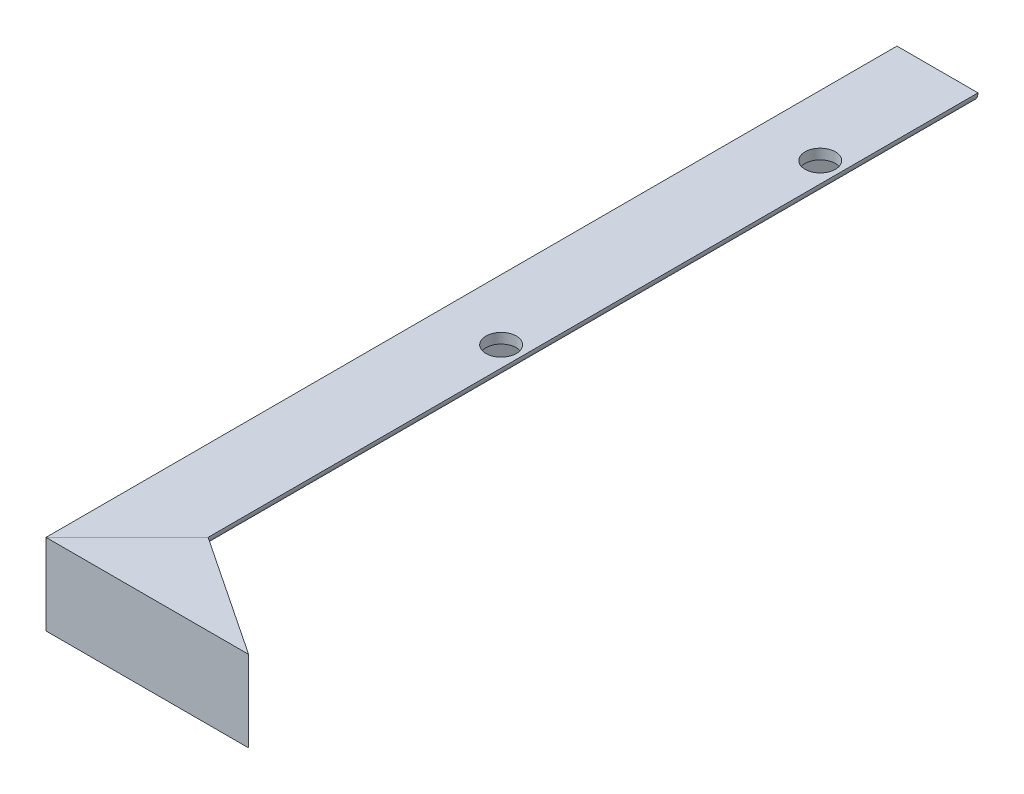
ISO-10303-21;
HEADER;
FILE_DESCRIPTION(('STEP AP214'),'2;1');
FILE_NAME('part.step','',(''),(''),'','','');
FILE_SCHEMA(('AUTOMOTIVE_DESIGN { 1 0 10303 214 1 1 1 1 }'));
ENDSEC;
DATA;
#1=APPLICATION_CONTEXT('core data for automotive mechanical design processes');
#2=APPLICATION_PROTOCOL_DEFINITION('international standard','automotive_design',2000,#1);
#3=PRODUCT_CONTEXT('',#1,'mechanical');
#4=PRODUCT('Part','Part','',(#3));
#5=PRODUCT_RELATED_PRODUCT_CATEGORY('part','',(#4));
#6=PRODUCT_DEFINITION_FORMATION('','',#4);
#7=PRODUCT_DEFINITION_CONTEXT('part definition',#1,'design');
#8=PRODUCT_DEFINITION('design','',#6,#7);
#9=PRODUCT_DEFINITION_SHAPE('','',#8);
#10=(LENGTH_UNIT() NAMED_UNIT(*) SI_UNIT(.MILLI.,.METRE.));
#11=(NAMED_UNIT(*) PLANE_ANGLE_UNIT() SI_UNIT($,.RADIAN.));
#12=(NAMED_UNIT(*) SI_UNIT($,.STERADIAN.) SOLID_ANGLE_UNIT());
#13=UNCERTAINTY_MEASURE_WITH_UNIT(LENGTH_MEASURE(1.E-05),#10,'distance_accuracy_value','');
#14=(GEOMETRIC_REPRESENTATION_CONTEXT(3) GLOBAL_UNCERTAINTY_ASSIGNED_CONTEXT((#13)) GLOBAL_UNIT_ASSIGNED_CONTEXT((#10,
#11,#12)) REPRESENTATION_CONTEXT('',''));
#15=CARTESIAN_POINT('',(0.,0.,0.));
#16=DIRECTION('',(0.,0.,1.));
#17=DIRECTION('',(1.,0.,0.));
#18=AXIS2_PLACEMENT_3D('',#15,#16,#17);
#19=CARTESIAN_POINT('',(5.27355936696949E-13,-50.8,0.));
#20=DIRECTION('',(1.,0.,0.));
#21=DIRECTION('',(0.,1.,0.));
#22=AXIS2_PLACEMENT_3D('',#19,#20,#21);
#23=PLANE('',#22);
#24=DIRECTION('',(0.,-1.,0.));
#25=VECTOR('',#24,1.);
#26=CARTESIAN_POINT('',(5.27355936696949E-13,-50.8,-5.27355936696949E-13));
#27=LINE('',#26,#25);
#28=CARTESIAN_POINT('',(0.,0.,0.));
#29=VERTEX_POINT('',#28);
#30=CARTESIAN_POINT('',(5.27355936696949E-13,-50.8,-5.27355936696949E-13));
#31=VERTEX_POINT('',#30);
#32=EDGE_CURVE('E252',#29,#31,#27,.T.);
#33=ORIENTED_EDGE('',*,*,#32,.F.);
#34=DIRECTION('',(0.,0.,-1.));
#35=VECTOR('',#34,1.);
#36=CARTESIAN_POINT('',(0.,0.,0.));
#37=LINE('',#36,#35);
#38=CARTESIAN_POINT('',(0.,0.,-533.4));
#39=VERTEX_POINT('',#38);
#40=EDGE_CURVE('E84',#29,#39,#37,.T.);
#41=ORIENTED_EDGE('',*,*,#40,.T.);
#42=DIRECTION('',(0.,-1.,0.));
#43=VECTOR('',#42,1.);
#44=CARTESIAN_POINT('',(5.27355936696949E-13,-50.8,-533.4));
#45=LINE('',#44,#43);
#46=CARTESIAN_POINT('',(5.27355936696949E-13,-50.8,-533.4));
#47=VERTEX_POINT('',#46);
#48=EDGE_CURVE('E227',#39,#47,#45,.T.);
#49=ORIENTED_EDGE('',*,*,#48,.T.);
#50=DIRECTION('',(0.,0.,-1.));
#51=VECTOR('',#50,1.);
#52=CARTESIAN_POINT('',(5.27355936696949E-13,-50.8,0.));
#53=LINE('',#52,#51);
#54=EDGE_CURVE('E226',#31,#47,#53,.T.);
#55=ORIENTED_EDGE('',*,*,#54,.F.);
#56=EDGE_LOOP('',(#33,#41,#49,#55));
#57=FACE_BOUND('',#56,.T.);
#58=ADVANCED_FACE('F80',(#57),#23,.F.);
#59=CARTESIAN_POINT('',(0.00508000000054576,-50.8,0.));
#60=DIRECTION('',(0.,1.,0.));
#61=DIRECTION('',(0.,0.,1.));
#62=AXIS2_PLACEMENT_3D('',#59,#60,#61);
#63=PLANE('',#62);
#64=DIRECTION('',(0.707106781186548,0.,-0.707106781186547));
#65=VECTOR('',#64,1.);
#66=CARTESIAN_POINT('',(0.00254000000027288,-50.8,-0.00254000000027288));
#67=LINE('',#66,#65);
#68=CARTESIAN_POINT('',(0.005080000000518,-50.8,-0.005080000000518));
#69=VERTEX_POINT('',#68);
#70=EDGE_CURVE('E248',#31,#69,#67,.T.);
#71=ORIENTED_EDGE('',*,*,#70,.F.);
#72=ORIENTED_EDGE('',*,*,#54,.T.);
#73=DIRECTION('',(1.,0.,0.));
#74=VECTOR('',#73,1.);
#75=CARTESIAN_POINT('',(0.00508000000054576,-50.8,-533.4));
#76=LINE('',#75,#74);
#77=CARTESIAN_POINT('',(0.005080000000518,-50.8,-533.4));
#78=VERTEX_POINT('',#77);
#79=EDGE_CURVE('E222',#47,#78,#76,.T.);
#80=ORIENTED_EDGE('',*,*,#79,.T.);
#81=DIRECTION('',(0.,0.,-1.));
#82=VECTOR('',#81,1.);
#83=CARTESIAN_POINT('',(0.005080000000518,-50.8,0.));
#84=LINE('',#83,#82);
#85=EDGE_CURVE('E221',#69,#78,#84,.T.);
#86=ORIENTED_EDGE('',*,*,#85,.F.);
#87=EDGE_LOOP('',(#71,#72,#80,#86));
#88=FACE_BOUND('',#87,.T.);
#89=ADVANCED_FACE('F309',(#88),#63,.F.);
#90=CARTESIAN_POINT('',(0.00508000000046249,-44.45508,0.));
#91=DIRECTION('',(0.,0.,-1.));
#92=DIRECTION('',(-1.,0.,0.));
#93=AXIS2_PLACEMENT_3D('',#90,#91,#92);
#94=CYLINDRICAL_SURFACE('',#93,6.34492);
#95=CARTESIAN_POINT('',(0.00508000000046249,-44.45508,-0.00508000000046249));
#96=DIRECTION('',(0.707106781186547,0.,0.707106781186548));
#97=DIRECTION('',(0.707106781186548,0.,-0.707106781186547));
#98=AXIS2_PLACEMENT_3D('',#95,#96,#97);
#99=ELLIPSE('',#98,8.97307191617229,6.34492);
#100=CARTESIAN_POINT('',(6.35000000000047,-44.4550799999999,-6.35000000000027));
#101=VERTEX_POINT('',#100);
#102=EDGE_CURVE('E244',#69,#101,#99,.T.);
#103=ORIENTED_EDGE('',*,*,#102,.F.);
#104=ORIENTED_EDGE('',*,*,#85,.T.);
#105=CARTESIAN_POINT('',(0.00508000000046249,-44.45508,-533.4));
#106=DIRECTION('',(0.,0.,1.));
#107=DIRECTION('',(1.,0.,0.));
#108=AXIS2_PLACEMENT_3D('',#105,#106,#107);
#109=CIRCLE('',#108,6.34492);
#110=CARTESIAN_POINT('',(6.35000000000047,-44.4550799999999,-533.4));
#111=VERTEX_POINT('',#110);
#112=EDGE_CURVE('E217',#78,#111,#109,.T.);
#113=ORIENTED_EDGE('',*,*,#112,.T.);
#114=DIRECTION('',(0.,0.,-1.));
#115=VECTOR('',#114,1.);
#116=CARTESIAN_POINT('',(6.35000000000047,-44.4550799999999,0.));
#117=LINE('',#116,#115);
#118=EDGE_CURVE('E216',#101,#111,#117,.T.);
#119=ORIENTED_EDGE('',*,*,#118,.F.);
#120=EDGE_LOOP('',(#103,#104,#113,#119));
#121=FACE_BOUND('',#120,.T.);
#122=ADVANCED_FACE('F289',(#121),#94,.T.);
#123=CARTESIAN_POINT('',(6.35000000000011,-11.1124999999999,0.));
#124=DIRECTION('',(-1.,0.,0.));
#125=DIRECTION('',(0.,-1.,0.));
#126=AXIS2_PLACEMENT_3D('',#123,#124,#125);
#127=PLANE('',#126);
#128=DIRECTION('',(0.,1.,0.));
#129=VECTOR('',#128,1.);
#130=CARTESIAN_POINT('',(6.35000000000011,-11.1124999999999,-6.35000000000011));
#131=LINE('',#130,#129);
#132=CARTESIAN_POINT('',(6.35000000000011,-11.1124999999999,-6.35000000000011));
#133=VERTEX_POINT('',#132);
#134=EDGE_CURVE('E240',#101,#133,#131,.T.);
#135=ORIENTED_EDGE('',*,*,#134,.F.);
#136=ORIENTED_EDGE('',*,*,#118,.T.);
#137=DIRECTION('',(0.,1.,0.));
#138=VECTOR('',#137,1.);
#139=CARTESIAN_POINT('',(6.35000000000011,-11.1124999999999,-533.4));
#140=LINE('',#139,#138);
#141=CARTESIAN_POINT('',(6.35000000000011,-11.1124999999999,-533.4));
#142=VERTEX_POINT('',#141);
#143=EDGE_CURVE('E212',#111,#142,#140,.T.);
#144=ORIENTED_EDGE('',*,*,#143,.T.);
#145=DIRECTION('',(0.,0.,-1.));
#146=VECTOR('',#145,1.);
#147=CARTESIAN_POINT('',(6.35000000000011,-11.1124999999999,0.));
#148=LINE('',#147,#146);
#149=EDGE_CURVE('E211',#133,#142,#148,.T.);
#150=ORIENTED_EDGE('',*,*,#149,.F.);
#151=EDGE_LOOP('',(#135,#136,#144,#150));
#152=FACE_BOUND('',#151,.T.);
#153=ADVANCED_FACE('F275',(#152),#127,.F.);
#154=CARTESIAN_POINT('',(11.1125000000001,-11.1124999999999,0.));
#155=DIRECTION('',(0.,0.,-1.));
#156=DIRECTION('',(-1.,0.,0.));
#157=AXIS2_PLACEMENT_3D('',#154,#155,#156);
#158=CYLINDRICAL_SURFACE('',#157,4.7625);
#159=CARTESIAN_POINT('',(11.1125000000001,-11.1124999999999,-11.1125000000001));
#160=DIRECTION('',(0.707106781186547,0.,0.707106781186548));
#161=DIRECTION('',(0.707106781186548,0.,-0.707106781186547));
#162=AXIS2_PLACEMENT_3D('',#159,#160,#161);
#163=ELLIPSE('',#162,6.73519209080186,4.7625);
#164=CARTESIAN_POINT('',(11.1125000000001,-6.34999999999991,-11.1125000000001));
#165=VERTEX_POINT('',#164);
#166=EDGE_CURVE('E236',#133,#165,#163,.F.);
#167=ORIENTED_EDGE('',*,*,#166,.F.);
#168=ORIENTED_EDGE('',*,*,#149,.T.);
#169=CARTESIAN_POINT('',(11.1125000000001,-11.1124999999999,-533.4));
#170=DIRECTION('',(0.,0.,-1.));
#171=DIRECTION('',(-1.,0.,0.));
#172=AXIS2_PLACEMENT_3D('',#169,#170,#171);
#173=CIRCLE('',#172,4.7625);
#174=CARTESIAN_POINT('',(11.1125000000001,-6.34999999999991,-533.4));
#175=VERTEX_POINT('',#174);
#176=EDGE_CURVE('E205',#142,#175,#173,.T.);
#177=ORIENTED_EDGE('',*,*,#176,.T.);
#178=DIRECTION('',(0.,0.,-1.));
#179=VECTOR('',#178,1.);
#180=CARTESIAN_POINT('',(11.1125000000001,-6.34999999999991,0.));
#181=LINE('',#180,#179);
#182=EDGE_CURVE('E200',#165,#175,#181,.T.);
#183=ORIENTED_EDGE('',*,*,#182,.F.);
#184=EDGE_LOOP('',(#167,#168,#177,#183));
#185=FACE_BOUND('',#184,.T.);
#186=ADVANCED_FACE('F270',(#185),#158,.F.);
#187=CARTESIAN_POINT('',(44.4550800000001,-6.34999999999952,0.));
#188=DIRECTION('',(0.,1.,0.));
#189=DIRECTION('',(-1.,0.,0.));
#190=AXIS2_PLACEMENT_3D('',#187,#188,#189);
#191=PLANE('',#190);
#192=DIRECTION('',(0.,0.,-1.));
#193=VECTOR('',#192,1.);
#194=CARTESIAN_POINT('',(44.4550800000001,-6.34999999999952,0.));
#195=LINE('',#194,#193);
#196=CARTESIAN_POINT('',(44.4550800000001,-6.34999999999952,-454.294968864879));
#197=VERTEX_POINT('',#196);
#198=CARTESIAN_POINT('',(44.4550800000001,-6.34999999999952,-533.4));
#199=VERTEX_POINT('',#198);
#200=EDGE_CURVE('E188',#197,#199,#195,.T.);
#201=ORIENTED_EDGE('',*,*,#200,.F.);
#202=CARTESIAN_POINT('',(38.1000000000001,-6.34999999999958,-447.2));
#203=DIRECTION('',(0.,1.,0.));
#204=DIRECTION('',(-1.,0.,0.));
#205=AXIS2_PLACEMENT_3D('',#202,#203,#204);
#206=CIRCLE('',#205,9.525);
#207=CARTESIAN_POINT('',(44.4550800000001,-6.34999999999952,-440.105031135121));
#208=VERTEX_POINT('',#207);
#209=EDGE_CURVE('E97',#197,#208,#206,.T.);
#210=ORIENTED_EDGE('',*,*,#209,.T.);
#211=CARTESIAN_POINT('',(44.4550800000001,-6.34999999999952,-254.294968864879));
#212=VERTEX_POINT('',#211);
#213=EDGE_CURVE('E178',#212,#208,#195,.T.);
#214=ORIENTED_EDGE('',*,*,#213,.F.);
#215=CARTESIAN_POINT('',(38.1000000000001,-6.34999999999958,-247.2));
#216=DIRECTION('',(0.,1.,0.));
#217=DIRECTION('',(-1.,0.,0.));
#218=AXIS2_PLACEMENT_3D('',#215,#216,#217);
#219=CIRCLE('',#218,9.525);
#220=CARTESIAN_POINT('',(44.4550800000001,-6.34999999999952,-240.105031135121));
#221=VERTEX_POINT('',#220);
#222=EDGE_CURVE('E104',#212,#221,#219,.T.);
#223=ORIENTED_EDGE('',*,*,#222,.T.);
#224=CARTESIAN_POINT('',(44.4550800000001,-6.34999999999952,-44.4550800000001));
#225=VERTEX_POINT('',#224);
#226=EDGE_CURVE('E176',#225,#221,#195,.T.);
#227=ORIENTED_EDGE('',*,*,#226,.F.);
#228=DIRECTION('',(0.707106781186548,0.,-0.707106781186547));
#229=VECTOR('',#228,1.);
#230=CARTESIAN_POINT('',(22.22754,-6.34999999999974,-22.22754));
#231=LINE('',#230,#229);
#232=EDGE_CURVE('E233',#165,#225,#231,.T.);
#233=ORIENTED_EDGE('',*,*,#232,.F.);
#234=ORIENTED_EDGE('',*,*,#182,.T.);
#235=DIRECTION('',(1.,0.,0.));
#236=VECTOR('',#235,1.);
#237=CARTESIAN_POINT('',(44.4550800000001,-6.34999999999952,-533.4));
#238=LINE('',#237,#236);
#239=EDGE_CURVE('E197',#175,#199,#238,.T.);
#240=ORIENTED_EDGE('',*,*,#239,.T.);
#241=EDGE_LOOP('',(#201,#210,#214,#223,#227,#233,#234,#240));
#242=FACE_BOUND('',#241,.T.);
#243=ADVANCED_FACE('F175',(#242),#191,.F.);
#244=CARTESIAN_POINT('',(44.45508,-0.00507999999954656,0.));
#245=DIRECTION('',(0.,0.,-1.));
#246=DIRECTION('',(-1.,0.,0.));
#247=AXIS2_PLACEMENT_3D('',#244,#245,#246);
#248=CYLINDRICAL_SURFACE('',#247,6.34492);
#249=ORIENTED_EDGE('',*,*,#213,.T.);
#250=CARTESIAN_POINT('',(44.4550800000001,-6.34999999999952,-440.105031135121));
#251=CARTESIAN_POINT('',(44.5563779594089,-6.34999862370733,-440.195761966752));
#252=CARTESIAN_POINT('',(44.6556993733316,-6.34757433182725,-440.288639685095));
#253=CARTESIAN_POINT('',(44.8501490510317,-6.33843650849954,-440.478426011735));
#254=CARTESIAN_POINT('',(44.9452786625206,-6.33172436656001,-440.575333304711));
#255=CARTESIAN_POINT('',(45.2237590366207,-6.30602088334706,-440.871415730806));
#256=CARTESIAN_POINT('',(45.4005923809026,-6.28145817985227,-441.076302076079));
#257=CARTESIAN_POINT('',(45.7350142586764,-6.22187702064616,-441.498717818989));
#258=CARTESIAN_POINT('',(45.8926547490551,-6.1868877190747,-441.716210619086));
#259=CARTESIAN_POINT('',(46.1886354442025,-6.11050030574277,-442.162994648589));
#260=CARTESIAN_POINT('',(46.3269682581813,-6.06909975254033,-442.39229035031));
#261=CARTESIAN_POINT('',(46.5703682408334,-5.98824494608204,-442.836983427356));
#262=CARTESIAN_POINT('',(46.6773974646644,-5.94903406434178,-443.051356314113));
#263=CARTESIAN_POINT('',(46.875034236627,-5.87134831627728,-443.487625045941));
#264=CARTESIAN_POINT('',(46.9656453454203,-5.83287329198757,-443.709519247413));
#265=CARTESIAN_POINT('',(47.1300520967265,-5.75926584218762,-444.160050976628));
#266=CARTESIAN_POINT('',(47.2038447966409,-5.72413400223613,-444.388689676516));
#267=CARTESIAN_POINT('',(47.3341043829323,-5.65968100352047,-444.851647554618));
#268=CARTESIAN_POINT('',(47.3905725495582,-5.63035941544686,-445.085966311704));
#269=CARTESIAN_POINT('',(47.4909870384248,-5.57687468936956,-445.58542182007));
#270=CARTESIAN_POINT('',(47.5328404923784,-5.55364876311484,-445.851086220786));
#271=CARTESIAN_POINT('',(47.593950866842,-5.51931078171624,-446.385798238018));
#272=CARTESIAN_POINT('',(47.613207806435,-5.50819871634216,-446.654845851676));
#273=CARTESIAN_POINT('',(47.6288062695833,-5.49921835890336,-447.193610874144));
#274=CARTESIAN_POINT('',(47.6251666495659,-5.50133916891232,-447.463327548989));
#275=CARTESIAN_POINT('',(47.5950754194385,-5.51858483893105,-448.001046274788));
#276=CARTESIAN_POINT('',(47.5686250284081,-5.53370900400039,-448.269048416601));
#277=CARTESIAN_POINT('',(47.4980550660229,-5.5728169990329,-448.767616842991));
#278=CARTESIAN_POINT('',(47.4565622628771,-5.59545453960822,-448.998669182044));
#279=CARTESIAN_POINT('',(47.3568691241608,-5.64784509973559,-449.456287291273));
#280=CARTESIAN_POINT('',(47.2986700837823,-5.6775975676556,-449.682853407799));
#281=CARTESIAN_POINT('',(47.1658886583961,-5.74223788015527,-450.130869360827));
#282=CARTESIAN_POINT('',(47.0912734472015,-5.77713596726113,-450.352307949427));
#283=CARTESIAN_POINT('',(46.9261636292398,-5.84972580615955,-450.788718384044));
#284=CARTESIAN_POINT('',(46.8356676208546,-5.88741780436926,-451.003689657302));
#285=CARTESIAN_POINT('',(46.6287403307717,-5.96719195704309,-451.448846077261));
#286=CARTESIAN_POINT('',(46.5105748164837,-6.00931493678623,-451.678219851227));
#287=CARTESIAN_POINT('',(46.2557338495108,-6.09059926644392,-452.127093390984));
#288=CARTESIAN_POINT('',(46.1190533459422,-6.12975980364605,-452.346590440564));
#289=CARTESIAN_POINT('',(45.8282337074499,-6.20143500335729,-452.773738436268));
#290=CARTESIAN_POINT('',(45.6741564466262,-6.23397213321665,-452.981427647297));
#291=CARTESIAN_POINT('',(45.348951106171,-6.28888109909382,-453.384272609183));
#292=CARTESIAN_POINT('',(45.1778378017148,-6.31126165174947,-453.579438983461));
#293=CARTESIAN_POINT('',(44.9118026271652,-6.33414285631068,-453.858896301083));
#294=CARTESIAN_POINT('',(44.822951028509,-6.33997663830193,-453.948592338069));
#295=CARTESIAN_POINT('',(44.6416614562835,-6.34790483255884,-454.124467145055));
#296=CARTESIAN_POINT('',(44.5492232026355,-6.34999895219452,-454.210645639291));
#297=CARTESIAN_POINT('',(44.4550800000001,-6.34999999999952,-454.294968864879));
#298=B_SPLINE_CURVE_WITH_KNOTS('',3,(#250,#251,#252,#253,#254,#255,#256,#257,#258,#259,#260,
#261,#262,#263,#264,#265,#266,#267,#268,#269,#270,#271,#272,#273,#274,#275,#276,#277,#278,#279,
#280,#281,#282,#283,#284,#285,#286,#287,#288,#289,#290,#291,#292,#293,#294,#295,#296,#297),
.UNSPECIFIED.,.F.,.F.,(4,2,2,2,2,2,2,2,2,2,2,2,2,2,2,2,2,2,2,2,2,2,2,4),(0.,0.407849550664783,
0.815567001799738,1.62943377951579,2.44104589737142,3.25296784532845,3.98069420808277,
4.70826255653464,5.43595810493962,6.16359986511574,6.97221878219325,7.78083701638815,
8.58878940148315,9.39669860973147,10.1034583867908,10.8101633853569,11.5182945847553,
12.2264883143365,13.0099513927473,13.7936286316985,14.5746015461289,15.3549029359011,
15.7339321533064,16.1129910285898),.UNSPECIFIED.);
#299=EDGE_CURVE('E180',#208,#197,#298,.T.);
#300=ORIENTED_EDGE('',*,*,#299,.T.);
#301=ORIENTED_EDGE('',*,*,#200,.T.);
#302=CARTESIAN_POINT('',(44.45508,-0.00507999999954656,-533.4));
#303=DIRECTION('',(0.,0.,1.));
#304=DIRECTION('',(-1.,0.,0.));
#305=AXIS2_PLACEMENT_3D('',#302,#303,#304);
#306=CIRCLE('',#305,6.34492);
#307=CARTESIAN_POINT('',(50.8,-0.00507999999949105,-533.4));
#308=VERTEX_POINT('',#307);
#309=EDGE_CURVE('E186',#199,#308,#306,.T.);
#310=ORIENTED_EDGE('',*,*,#309,.T.);
#311=DIRECTION('',(0.,0.,-1.));
#312=VECTOR('',#311,1.);
#313=CARTESIAN_POINT('',(50.8,-0.00507999999949105,0.));
#314=LINE('',#313,#312);
#315=CARTESIAN_POINT('',(50.8,-0.00507999999949105,-50.8));
#316=VERTEX_POINT('',#315);
#317=EDGE_CURVE('E192',#316,#308,#314,.T.);
#318=ORIENTED_EDGE('',*,*,#317,.F.);
#319=CARTESIAN_POINT('',(44.45508,-0.00507999999954656,-44.45508));
#320=DIRECTION('',(0.707106781186547,0.,0.707106781186548));
#321=DIRECTION('',(0.707106781186548,0.,-0.707106781186547));
#322=AXIS2_PLACEMENT_3D('',#319,#320,#321);
#323=ELLIPSE('',#322,8.97307191617229,6.34492);
#324=EDGE_CURVE('E90',#225,#316,#323,.T.);
#325=ORIENTED_EDGE('',*,*,#324,.F.);
#326=ORIENTED_EDGE('',*,*,#226,.T.);
#327=CARTESIAN_POINT('',(44.4550800000001,-6.34999999999952,-240.105031135121));
#328=CARTESIAN_POINT('',(44.5563779594089,-6.34999862370733,-240.195761966752));
#329=CARTESIAN_POINT('',(44.6556993733316,-6.34757433182725,-240.288639685095));
#330=CARTESIAN_POINT('',(44.8501490510317,-6.33843650849954,-240.478426011735));
#331=CARTESIAN_POINT('',(44.9452786625206,-6.33172436656001,-240.575333304711));
#332=CARTESIAN_POINT('',(45.2237590366208,-6.30602088334706,-240.871415730806));
#333=CARTESIAN_POINT('',(45.4005923809027,-6.28145817985227,-241.076302076079));
#334=CARTESIAN_POINT('',(45.7350142586764,-6.22187702064616,-241.498717818989));
#335=CARTESIAN_POINT('',(45.8926547490551,-6.18688771907469,-241.716210619086));
#336=CARTESIAN_POINT('',(46.1886354442025,-6.11050030574277,-242.162994648589));
#337=CARTESIAN_POINT('',(46.3269682581813,-6.06909975254033,-242.39229035031));
#338=CARTESIAN_POINT('',(46.5703682408333,-5.98824494608204,-242.836983427356));
#339=CARTESIAN_POINT('',(46.6773974646645,-5.94903406434178,-243.051356314113));
#340=CARTESIAN_POINT('',(46.8750342366271,-5.87134831627727,-243.487625045941));
#341=CARTESIAN_POINT('',(46.9656453454203,-5.83287329198757,-243.709519247413));
#342=CARTESIAN_POINT('',(47.1300520967265,-5.75926584218762,-244.160050976628));
#343=CARTESIAN_POINT('',(47.2038447966409,-5.72413400223613,-244.388689676516));
#344=CARTESIAN_POINT('',(47.3341043829323,-5.65968100352047,-244.851647554618));
#345=CARTESIAN_POINT('',(47.3905725495582,-5.63035941544686,-245.085966311704));
#346=CARTESIAN_POINT('',(47.4909870384248,-5.57687468936956,-245.58542182007));
#347=CARTESIAN_POINT('',(47.5328404923784,-5.55364876311484,-245.851086220787));
#348=CARTESIAN_POINT('',(47.593950866842,-5.51931078171624,-246.385798238018));
#349=CARTESIAN_POINT('',(47.613207806435,-5.50819871634216,-246.654845851676));
#350=CARTESIAN_POINT('',(47.6288062695833,-5.49921835890335,-247.193610874144));
#351=CARTESIAN_POINT('',(47.6251666495658,-5.50133916891232,-247.463327548989));
#352=CARTESIAN_POINT('',(47.5950754194385,-5.51858483893105,-248.001046274788));
#353=CARTESIAN_POINT('',(47.5686250284081,-5.53370900400039,-248.269048416601));
#354=CARTESIAN_POINT('',(47.498055066023,-5.57281699903289,-248.767616842991));
#355=CARTESIAN_POINT('',(47.4565622628771,-5.59545453960821,-248.998669182044));
#356=CARTESIAN_POINT('',(47.3568691241608,-5.64784509973557,-249.456287291273));
#357=CARTESIAN_POINT('',(47.2986700837823,-5.6775975676556,-249.682853407799));
#358=CARTESIAN_POINT('',(47.1658886583961,-5.74223788015527,-250.130869360827));
#359=CARTESIAN_POINT('',(47.0912734472015,-5.77713596726113,-250.352307949427));
#360=CARTESIAN_POINT('',(46.9261636292398,-5.84972580615955,-250.788718384044));
#361=CARTESIAN_POINT('',(46.8356676208547,-5.88741780436926,-251.003689657302));
#362=CARTESIAN_POINT('',(46.6287403307717,-5.96719195704309,-251.448846077261));
#363=CARTESIAN_POINT('',(46.5105748164837,-6.00931493678624,-251.678219851227));
#364=CARTESIAN_POINT('',(46.2557338495108,-6.09059926644392,-252.127093390984));
#365=CARTESIAN_POINT('',(46.1190533459422,-6.12975980364605,-252.346590440564));
#366=CARTESIAN_POINT('',(45.8282337074499,-6.20143500335729,-252.773738436268));
#367=CARTESIAN_POINT('',(45.6741564466262,-6.23397213321665,-252.981427647297));
#368=CARTESIAN_POINT('',(45.348951106171,-6.28888109909382,-253.384272609183));
#369=CARTESIAN_POINT('',(45.1778378017148,-6.31126165174947,-253.579438983461));
#370=CARTESIAN_POINT('',(44.9118026271652,-6.33414285631068,-253.858896301083));
#371=CARTESIAN_POINT('',(44.822951028509,-6.33997663830193,-253.948592338069));
#372=CARTESIAN_POINT('',(44.6416614562835,-6.34790483255884,-254.124467145055));
#373=CARTESIAN_POINT('',(44.5492232026355,-6.34999895219452,-254.210645639291));
#374=CARTESIAN_POINT('',(44.4550800000001,-6.34999999999952,-254.294968864879));
#375=B_SPLINE_CURVE_WITH_KNOTS('',3,(#327,#328,#329,#330,#331,#332,#333,#334,#335,#336,#337,
#338,#339,#340,#341,#342,#343,#344,#345,#346,#347,#348,#349,#350,#351,#352,#353,#354,#355,#356,
#357,#358,#359,#360,#361,#362,#363,#364,#365,#366,#367,#368,#369,#370,#371,#372,#373,#374),
.UNSPECIFIED.,.F.,.F.,(4,2,2,2,2,2,2,2,2,2,2,2,2,2,2,2,2,2,2,2,2,2,2,4),(0.,0.407849550664807,
0.815567001799748,1.62943377951583,2.4410458973714,3.25296784532846,3.98069420808283,
4.70826255653464,5.43595810493959,6.16359986511574,6.97221878219333,7.78083701638812,
8.58878940148312,9.39669860973141,10.1034583867908,10.8101633853569,11.5182945847552,
12.2264883143365,13.0099513927474,13.7936286316984,14.5746015461289,15.3549029359011,
15.7339321533064,16.1129910285898),.UNSPECIFIED.);
#376=EDGE_CURVE('E163',#221,#212,#375,.T.);
#377=ORIENTED_EDGE('',*,*,#376,.T.);
#378=EDGE_LOOP('',(#249,#300,#301,#310,#318,#325,#326,#377));
#379=FACE_BOUND('',#378,.T.);
#380=ADVANCED_FACE('F182',(#379),#248,.T.);
#381=CARTESIAN_POINT('',(50.8,5.55111512312578E-13,0.));
#382=DIRECTION('',(-1.,0.,0.));
#383=DIRECTION('',(0.,0.,1.));
#384=AXIS2_PLACEMENT_3D('',#381,#382,#383);
#385=PLANE('',#384);
#386=DIRECTION('',(0.,1.,0.));
#387=VECTOR('',#386,1.);
#388=CARTESIAN_POINT('',(50.8,5.55111512312578E-13,-50.8));
#389=LINE('',#388,#387);
#390=CARTESIAN_POINT('',(50.8,5.55111512312578E-13,-50.8));
#391=VERTEX_POINT('',#390);
#392=EDGE_CURVE('E14',#316,#391,#389,.T.);
#393=ORIENTED_EDGE('',*,*,#392,.F.);
#394=ORIENTED_EDGE('',*,*,#317,.T.);
#395=DIRECTION('',(0.,1.,0.));
#396=VECTOR('',#395,1.);
#397=CARTESIAN_POINT('',(50.8,5.55111512312578E-13,-533.4));
#398=LINE('',#397,#396);
#399=CARTESIAN_POINT('',(50.8,5.55111512312578E-13,-533.4));
#400=VERTEX_POINT('',#399);
#401=EDGE_CURVE('E284',#308,#400,#398,.T.);
#402=ORIENTED_EDGE('',*,*,#401,.T.);
#403=DIRECTION('',(0.,0.,-1.));
#404=VECTOR('',#403,1.);
#405=CARTESIAN_POINT('',(50.8,5.55111512312578E-13,0.));
#406=LINE('',#405,#404);
#407=EDGE_CURVE('E301',#391,#400,#406,.T.);
#408=ORIENTED_EDGE('',*,*,#407,.F.);
#409=EDGE_LOOP('',(#393,#394,#402,#408));
#410=FACE_BOUND('',#409,.T.);
#411=ADVANCED_FACE('F308',(#410),#385,.F.);
#412=CARTESIAN_POINT('',(0.,0.,0.));
#413=DIRECTION('',(0.,-1.,0.));
#414=DIRECTION('',(1.,0.,0.));
#415=AXIS2_PLACEMENT_3D('',#412,#413,#414);
#416=PLANE('',#415);
#417=CARTESIAN_POINT('',(38.1,3.88578058618805E-13,-447.2));
#418=DIRECTION('',(0.,1.,0.));
#419=DIRECTION('',(-1.,0.,0.));
#420=AXIS2_PLACEMENT_3D('',#417,#418,#419);
#421=CIRCLE('',#420,9.525);
#422=CARTESIAN_POINT('',(28.575,2.88808979361362E-13,-447.2));
#423=VERTEX_POINT('',#422);
#424=EDGE_CURVE('E170',#423,#423,#421,.T.);
#425=ORIENTED_EDGE('',*,*,#424,.F.);
#426=EDGE_LOOP('',(#425));
#427=FACE_BOUND('',#426,.T.);
#428=CARTESIAN_POINT('',(38.1,3.88578058618805E-13,-247.2));
#429=DIRECTION('',(0.,1.,0.));
#430=DIRECTION('',(-1.,0.,0.));
#431=AXIS2_PLACEMENT_3D('',#428,#429,#430);
#432=CIRCLE('',#431,9.525);
#433=CARTESIAN_POINT('',(28.575,2.88808979361362E-13,-247.2));
#434=VERTEX_POINT('',#433);
#435=EDGE_CURVE('E360',#434,#434,#432,.T.);
#436=ORIENTED_EDGE('',*,*,#435,.F.);
#437=EDGE_LOOP('',(#436));
#438=FACE_BOUND('',#437,.T.);
#439=DIRECTION('',(-0.707106781186548,0.,0.707106781186547));
#440=VECTOR('',#439,1.);
#441=CARTESIAN_POINT('',(0.,0.,0.));
#442=LINE('',#441,#440);
#443=EDGE_CURVE('E256',#391,#29,#442,.T.);
#444=ORIENTED_EDGE('',*,*,#443,.F.);
#445=ORIENTED_EDGE('',*,*,#407,.T.);
#446=DIRECTION('',(-1.,0.,0.));
#447=VECTOR('',#446,1.);
#448=CARTESIAN_POINT('',(0.,0.,-533.4));
#449=LINE('',#448,#447);
#450=EDGE_CURVE('E260',#400,#39,#449,.T.);
#451=ORIENTED_EDGE('',*,*,#450,.T.);
#452=ORIENTED_EDGE('',*,*,#40,.F.);
#453=EDGE_LOOP('',(#444,#445,#451,#452));
#454=FACE_BOUND('',#453,.T.);
#455=ADVANCED_FACE('F300',(#427,#438,#454),#416,.F.);
#456=CARTESIAN_POINT('',(44.45508,-0.00507999999954656,-533.4));
#457=DIRECTION('',(0.,0.,-1.));
#458=DIRECTION('',(-1.,0.,0.));
#459=AXIS2_PLACEMENT_3D('',#456,#457,#458);
#460=PLANE('',#459);
#461=ORIENTED_EDGE('',*,*,#48,.F.);
#462=ORIENTED_EDGE('',*,*,#450,.F.);
#463=ORIENTED_EDGE('',*,*,#401,.F.);
#464=ORIENTED_EDGE('',*,*,#309,.F.);
#465=ORIENTED_EDGE('',*,*,#239,.F.);
#466=ORIENTED_EDGE('',*,*,#176,.F.);
#467=ORIENTED_EDGE('',*,*,#143,.F.);
#468=ORIENTED_EDGE('',*,*,#112,.F.);
#469=ORIENTED_EDGE('',*,*,#79,.F.);
#470=EDGE_LOOP('',(#461,#462,#463,#464,#465,#466,#467,#468,#469));
#471=FACE_BOUND('',#470,.T.);
#472=ADVANCED_FACE('F280',(#471),#460,.T.);
#473=CARTESIAN_POINT('',(0.,0.,0.));
#474=DIRECTION('',(0.707106781186547,0.,0.707106781186548));
#475=DIRECTION('',(0.707106781186548,0.,-0.707106781186547));
#476=AXIS2_PLACEMENT_3D('',#473,#474,#475);
#477=PLANE('',#476);
#478=ORIENTED_EDGE('',*,*,#443,.T.);
#479=ORIENTED_EDGE('',*,*,#32,.T.);
#480=ORIENTED_EDGE('',*,*,#70,.T.);
#481=ORIENTED_EDGE('',*,*,#102,.T.);
#482=ORIENTED_EDGE('',*,*,#134,.T.);
#483=ORIENTED_EDGE('',*,*,#166,.T.);
#484=ORIENTED_EDGE('',*,*,#232,.T.);
#485=ORIENTED_EDGE('',*,*,#324,.T.);
#486=ORIENTED_EDGE('',*,*,#392,.T.);
#487=EDGE_LOOP('',(#478,#479,#480,#481,#482,#483,#484,#485,#486));
#488=FACE_BOUND('',#487,.T.);
#489=ADVANCED_FACE('F82',(#488),#477,.T.);
#490=CARTESIAN_POINT('',(38.1000000000005,-50.8000000000009,-247.2));
#491=DIRECTION('',(0.,1.,0.));
#492=DIRECTION('',(-1.,0.,0.));
#493=AXIS2_PLACEMENT_3D('',#490,#491,#492);
#494=CYLINDRICAL_SURFACE('',#493,9.525);
#495=ORIENTED_EDGE('',*,*,#435,.T.);
#496=EDGE_LOOP('',(#495));
#497=FACE_BOUND('',#496,.T.);
#498=ORIENTED_EDGE('',*,*,#376,.F.);
#499=ORIENTED_EDGE('',*,*,#222,.F.);
#500=EDGE_LOOP('',(#498,#499));
#501=FACE_BOUND('',#500,.T.);
#502=ADVANCED_FACE('F164',(#497,#501),#494,.F.);
#503=CARTESIAN_POINT('',(38.1000000000005,-50.8000000000009,-447.2));
#504=DIRECTION('',(0.,1.,0.));
#505=DIRECTION('',(-1.,0.,0.));
#506=AXIS2_PLACEMENT_3D('',#503,#504,#505);
#507=CYLINDRICAL_SURFACE('',#506,9.525);
#508=ORIENTED_EDGE('',*,*,#424,.T.);
#509=EDGE_LOOP('',(#508));
#510=FACE_BOUND('',#509,.T.);
#511=ORIENTED_EDGE('',*,*,#299,.F.);
#512=ORIENTED_EDGE('',*,*,#209,.F.);
#513=EDGE_LOOP('',(#511,#512));
#514=FACE_BOUND('',#513,.T.);
#515=ADVANCED_FACE('F341',(#510,#514),#507,.F.);
#516=CLOSED_SHELL('',(#58,#89,#122,#153,#186,#243,#380,#411,#455,#472,#489,#502,#515));
#517=MANIFOLD_SOLID_BREP('B2',#516);
#518=CARTESIAN_POINT('',(127.,-50.8,-5.27355936696949E-13));
#519=DIRECTION('',(0.,0.,-1.));
#520=DIRECTION('',(0.,1.,0.));
#521=AXIS2_PLACEMENT_3D('',#518,#519,#520);
#522=PLANE('',#521);
#523=DIRECTION('',(0.,1.,0.));
#524=VECTOR('',#523,1.);
#525=CARTESIAN_POINT('',(5.27355936696949E-13,-50.8000000000013,-5.27355936696949E-13));
#526=LINE('',#525,#524);
#527=CARTESIAN_POINT('',(5.55111512312578E-13,-50.8,-5.27355936696949E-13));
#528=VERTEX_POINT('',#527);
#529=CARTESIAN_POINT('',(0.,0.,0.));
#530=VERTEX_POINT('',#529);
#531=EDGE_CURVE('E535',#528,#530,#526,.T.);
#532=ORIENTED_EDGE('',*,*,#531,.F.);
#533=DIRECTION('',(-1.,0.,0.));
#534=VECTOR('',#533,1.);
#535=CARTESIAN_POINT('',(127.,-50.8,-5.27355936696949E-13));
#536=LINE('',#535,#534);
#537=CARTESIAN_POINT('',(127.,-50.8,-5.27355936696949E-13));
#538=VERTEX_POINT('',#537);
#539=EDGE_CURVE('E541',#538,#528,#536,.T.);
#540=ORIENTED_EDGE('',*,*,#539,.F.);
#541=DIRECTION('',(0.,-1.,0.));
#542=VECTOR('',#541,1.);
#543=CARTESIAN_POINT('',(127.,-50.8,-5.27355936696949E-13));
#544=LINE('',#543,#542);
#545=CARTESIAN_POINT('',(127.,0.,0.));
#546=VERTEX_POINT('',#545);
#547=EDGE_CURVE('E551',#546,#538,#544,.T.);
#548=ORIENTED_EDGE('',*,*,#547,.F.);
#549=DIRECTION('',(-1.,0.,0.));
#550=VECTOR('',#549,1.);
#551=CARTESIAN_POINT('',(127.,0.,0.));
#552=LINE('',#551,#550);
#553=EDGE_CURVE('E456',#546,#530,#552,.T.);
#554=ORIENTED_EDGE('',*,*,#553,.T.);
#555=EDGE_LOOP('',(#532,#540,#548,#554));
#556=FACE_BOUND('',#555,.T.);
#557=ADVANCED_FACE('F452',(#556),#522,.F.);
#558=CARTESIAN_POINT('',(127.,-50.8,-0.00508000000054576));
#559=DIRECTION('',(0.,1.,0.));
#560=DIRECTION('',(0.,0.,1.));
#561=AXIS2_PLACEMENT_3D('',#558,#559,#560);
#562=PLANE('',#561);
#563=DIRECTION('',(-1.,0.,0.));
#564=VECTOR('',#563,1.);
#565=CARTESIAN_POINT('',(127.,-50.8,-0.005080000000518));
#566=LINE('',#565,#564);
#567=CARTESIAN_POINT('',(126.99238,-50.8,-0.005080000000518));
#568=VERTEX_POINT('',#567);
#569=CARTESIAN_POINT('',(0.005080000000518,-50.8,-0.005080000000518));
#570=VERTEX_POINT('',#569);
#571=EDGE_CURVE('E544',#568,#570,#566,.T.);
#572=ORIENTED_EDGE('',*,*,#571,.F.);
#573=DIRECTION('',(0.832050294337844,0.,0.554700196225229));
#574=VECTOR('',#573,1.);
#575=CARTESIAN_POINT('',(126.997655384615,-50.8,-0.00156307692361635));
#576=LINE('',#575,#574);
#577=EDGE_CURVE('E556',#568,#538,#576,.T.);
#578=ORIENTED_EDGE('',*,*,#577,.T.);
#579=ORIENTED_EDGE('',*,*,#539,.T.);
#580=DIRECTION('',(-0.707106781186547,0.,0.707106781186548));
#581=VECTOR('',#580,1.);
#582=CARTESIAN_POINT('',(63.5025400000003,-50.8,-63.5025400000003));
#583=LINE('',#582,#581);
#584=EDGE_CURVE('E537',#570,#528,#583,.T.);
#585=ORIENTED_EDGE('',*,*,#584,.F.);
#586=EDGE_LOOP('',(#572,#578,#579,#585));
#587=FACE_BOUND('',#586,.T.);
#588=ADVANCED_FACE('F592',(#587),#562,.F.);
#589=CARTESIAN_POINT('',(127.,-44.45508,-0.00508000000046249));
#590=DIRECTION('',(-1.,0.,0.));
#591=DIRECTION('',(0.,0.,1.));
#592=AXIS2_PLACEMENT_3D('',#589,#590,#591);
#593=CYLINDRICAL_SURFACE('',#592,6.34492);
#594=DIRECTION('',(-1.,0.,0.));
#595=VECTOR('',#594,1.);
#596=CARTESIAN_POINT('',(127.,-44.4550799999999,-6.35000000000047));
#597=LINE('',#596,#595);
#598=CARTESIAN_POINT('',(117.475,-44.4550799999999,-6.35000000000047));
#599=VERTEX_POINT('',#598);
#600=CARTESIAN_POINT('',(6.3500000000003,-44.4550799999999,-6.35000000000047));
#601=VERTEX_POINT('',#600);
#602=EDGE_CURVE('E546',#599,#601,#597,.T.);
#603=ORIENTED_EDGE('',*,*,#602,.F.);
#604=CARTESIAN_POINT('',(126.99238,-44.45508,-0.00508000000046249));
#605=DIRECTION('',(-0.554700196225229,0.,0.832050294337844));
#606=DIRECTION('',(-0.832050294337844,0.,-0.554700196225229));
#607=AXIS2_PLACEMENT_3D('',#604,#605,#606);
#608=ELLIPSE('',#607,11.4384671993585,6.34492);
#609=EDGE_CURVE('E590',#599,#568,#608,.T.);
#610=ORIENTED_EDGE('',*,*,#609,.T.);
#611=ORIENTED_EDGE('',*,*,#571,.T.);
#612=CARTESIAN_POINT('',(0.00508000000046249,-44.45508,-0.00508000000046249));
#613=DIRECTION('',(-0.707106781186548,0.,-0.707106781186547));
#614=DIRECTION('',(-0.707106781186547,0.,0.707106781186548));
#615=AXIS2_PLACEMENT_3D('',#612,#613,#614);
#616=ELLIPSE('',#615,8.97307191617229,6.34492);
#617=EDGE_CURVE('E78',#601,#570,#616,.T.);
#618=ORIENTED_EDGE('',*,*,#617,.F.);
#619=EDGE_LOOP('',(#603,#610,#611,#618));
#620=FACE_BOUND('',#619,.T.);
#621=ADVANCED_FACE('F587',(#620),#593,.T.);
#622=CARTESIAN_POINT('',(127.,-11.1124999999999,-6.35000000000011));
#623=DIRECTION('',(0.,0.,1.));
#624=DIRECTION('',(0.,-1.,0.));
#625=AXIS2_PLACEMENT_3D('',#622,#623,#624);
#626=PLANE('',#625);
#627=DIRECTION('',(-1.,0.,0.));
#628=VECTOR('',#627,1.);
#629=CARTESIAN_POINT('',(127.,-11.1124999999999,-6.35000000000011));
#630=LINE('',#629,#628);
#631=CARTESIAN_POINT('',(117.475,-11.1124999999999,-6.35000000000011));
#632=VERTEX_POINT('',#631);
#633=CARTESIAN_POINT('',(6.35000000000013,-11.1124999999999,-6.35000000000011));
#634=VERTEX_POINT('',#633);
#635=EDGE_CURVE('E548',#632,#634,#630,.T.);
#636=ORIENTED_EDGE('',*,*,#635,.F.);
#637=DIRECTION('',(0.,-1.,0.));
#638=VECTOR('',#637,1.);
#639=CARTESIAN_POINT('',(117.475,-11.1124999999999,-6.35000000000011));
#640=LINE('',#639,#638);
#641=EDGE_CURVE('E584',#632,#599,#640,.T.);
#642=ORIENTED_EDGE('',*,*,#641,.T.);
#643=ORIENTED_EDGE('',*,*,#602,.T.);
#644=DIRECTION('',(0.,-1.,0.));
#645=VECTOR('',#644,1.);
#646=CARTESIAN_POINT('',(6.35000000000013,-11.1125000000012,-6.35000000000011));
#647=LINE('',#646,#645);
#648=EDGE_CURVE('E461',#634,#601,#647,.T.);
#649=ORIENTED_EDGE('',*,*,#648,.F.);
#650=EDGE_LOOP('',(#636,#642,#643,#649));
#651=FACE_BOUND('',#650,.T.);
#652=ADVANCED_FACE('F581',(#651),#626,.F.);
#653=CARTESIAN_POINT('',(127.,-11.1124999999999,-11.1125000000001));
#654=DIRECTION('',(-1.,0.,0.));
#655=DIRECTION('',(0.,0.,1.));
#656=AXIS2_PLACEMENT_3D('',#653,#654,#655);
#657=CYLINDRICAL_SURFACE('',#656,4.7625);
#658=DIRECTION('',(-1.,0.,0.));
#659=VECTOR('',#658,1.);
#660=CARTESIAN_POINT('',(127.,-6.34999999999991,-11.1125000000001));
#661=LINE('',#660,#659);
#662=CARTESIAN_POINT('',(110.33125,-6.34999999999991,-11.1125000000001));
#663=VERTEX_POINT('',#662);
#664=CARTESIAN_POINT('',(11.1125000000001,-6.34999999999991,-11.1125000000001));
#665=VERTEX_POINT('',#664);
#666=EDGE_CURVE('E550',#663,#665,#661,.T.);
#667=ORIENTED_EDGE('',*,*,#666,.F.);
#668=CARTESIAN_POINT('',(110.33125,-11.1124999999999,-11.1125000000001));
#669=DIRECTION('',(-0.554700196225229,0.,0.832050294337844));
#670=DIRECTION('',(-0.832050294337844,0.,-0.554700196225229));
#671=AXIS2_PLACEMENT_3D('',#668,#669,#670);
#672=ELLIPSE('',#671,8.58571897469863,4.7625);
#673=EDGE_CURVE('E595',#663,#632,#672,.F.);
#674=ORIENTED_EDGE('',*,*,#673,.T.);
#675=ORIENTED_EDGE('',*,*,#635,.T.);
#676=CARTESIAN_POINT('',(11.1125000000001,-11.1124999999999,-11.1125000000001));
#677=DIRECTION('',(-0.707106781186548,0.,-0.707106781186547));
#678=DIRECTION('',(-0.707106781186547,0.,0.707106781186548));
#679=AXIS2_PLACEMENT_3D('',#676,#677,#678);
#680=ELLIPSE('',#679,6.73519209080186,4.7625);
#681=EDGE_CURVE('E561',#665,#634,#680,.F.);
#682=ORIENTED_EDGE('',*,*,#681,.F.);
#683=EDGE_LOOP('',(#667,#674,#675,#682));
#684=FACE_BOUND('',#683,.T.);
#685=ADVANCED_FACE('F576',(#684),#657,.F.);
#686=CARTESIAN_POINT('',(127.,-6.34999999999952,-44.4550800000001));
#687=DIRECTION('',(0.,1.,0.));
#688=DIRECTION('',(0.,0.,1.));
#689=AXIS2_PLACEMENT_3D('',#686,#687,#688);
#690=PLANE('',#689);
#691=DIRECTION('',(-1.,0.,0.));
#692=VECTOR('',#691,1.);
#693=CARTESIAN_POINT('',(127.,-6.34999999999952,-44.4550800000001));
#694=LINE('',#693,#692);
#695=CARTESIAN_POINT('',(60.31738,-6.34999999999952,-44.4550800000001));
#696=VERTEX_POINT('',#695);
#697=CARTESIAN_POINT('',(44.4550800000001,-6.34999999999952,-44.4550800000001));
#698=VERTEX_POINT('',#697);
#699=EDGE_CURVE('E475',#696,#698,#694,.T.);
#700=ORIENTED_EDGE('',*,*,#699,.F.);
#701=DIRECTION('',(0.832050294337844,0.,0.554700196225229));
#702=VECTOR('',#701,1.);
#703=CARTESIAN_POINT('',(106.482270769231,-6.34999999999986,-13.6784861538462));
#704=LINE('',#703,#702);
#705=EDGE_CURVE('E567',#696,#663,#704,.T.);
#706=ORIENTED_EDGE('',*,*,#705,.T.);
#707=ORIENTED_EDGE('',*,*,#666,.T.);
#708=DIRECTION('',(-0.707106781186547,0.,0.707106781186548));
#709=VECTOR('',#708,1.);
#710=CARTESIAN_POINT('',(85.72754,-6.34999999999908,-85.72754));
#711=LINE('',#710,#709);
#712=EDGE_CURVE('E564',#698,#665,#711,.T.);
#713=ORIENTED_EDGE('',*,*,#712,.F.);
#714=EDGE_LOOP('',(#700,#706,#707,#713));
#715=FACE_BOUND('',#714,.T.);
#716=ADVANCED_FACE('F571',(#715),#690,.F.);
#717=CARTESIAN_POINT('',(127.,-0.00507999999954656,-44.45508));
#718=DIRECTION('',(-1.,0.,0.));
#719=DIRECTION('',(0.,0.,1.));
#720=AXIS2_PLACEMENT_3D('',#717,#718,#719);
#721=CYLINDRICAL_SURFACE('',#720,6.34492);
#722=CARTESIAN_POINT('',(44.45508,-0.00507999999954656,-44.45508));
#723=DIRECTION('',(-0.707106781186548,0.,-0.707106781186547));
#724=DIRECTION('',(-0.707106781186547,0.,0.707106781186548));
#725=AXIS2_PLACEMENT_3D('',#722,#723,#724);
#726=ELLIPSE('',#725,8.97307191617229,6.34492);
#727=CARTESIAN_POINT('',(50.8,-0.00507999999949105,-50.8));
#728=VERTEX_POINT('',#727);
#729=EDGE_CURVE('E525',#728,#698,#726,.T.);
#730=ORIENTED_EDGE('',*,*,#729,.F.);
#731=CARTESIAN_POINT('',(60.31738,-0.00507999999954656,-44.45508));
#732=DIRECTION('',(-0.554700196225229,0.,0.832050294337844));
#733=DIRECTION('',(-0.832050294337844,0.,-0.554700196225229));
#734=AXIS2_PLACEMENT_3D('',#731,#732,#733);
#735=ELLIPSE('',#734,11.4384671993585,6.34492);
#736=EDGE_CURVE('E469',#728,#696,#735,.T.);
#737=ORIENTED_EDGE('',*,*,#736,.T.);
#738=ORIENTED_EDGE('',*,*,#699,.T.);
#739=EDGE_LOOP('',(#730,#737,#738));
#740=FACE_BOUND('',#739,.T.);
#741=ADVANCED_FACE('F566',(#740),#721,.T.);
#742=CARTESIAN_POINT('',(127.,0.,0.));
#743=DIRECTION('',(0.,-1.,0.));
#744=DIRECTION('',(0.,0.,-1.));
#745=AXIS2_PLACEMENT_3D('',#742,#743,#744);
#746=PLANE('',#745);
#747=ORIENTED_EDGE('',*,*,#553,.F.);
#748=DIRECTION('',(0.832050294337844,0.,0.554700196225229));
#749=VECTOR('',#748,1.);
#750=CARTESIAN_POINT('',(127.,0.,0.));
#751=LINE('',#750,#749);
#752=CARTESIAN_POINT('',(50.8,5.55111512312578E-13,-50.8));
#753=VERTEX_POINT('',#752);
#754=EDGE_CURVE('E520',#753,#546,#751,.T.);
#755=ORIENTED_EDGE('',*,*,#754,.F.);
#756=DIRECTION('',(0.707106781186547,0.,-0.707106781186548));
#757=VECTOR('',#756,1.);
#758=CARTESIAN_POINT('',(63.5,6.66133814775094E-13,-63.5));
#759=LINE('',#758,#757);
#760=EDGE_CURVE('E526',#530,#753,#759,.T.);
#761=ORIENTED_EDGE('',*,*,#760,.F.);
#762=EDGE_LOOP('',(#747,#755,#761));
#763=FACE_BOUND('',#762,.T.);
#764=ADVANCED_FACE('F530',(#763),#746,.F.);
#765=CARTESIAN_POINT('',(0.,0.,0.));
#766=DIRECTION('',(-0.707106781186548,0.,-0.707106781186547));
#767=DIRECTION('',(-0.707106781186547,0.,0.707106781186548));
#768=AXIS2_PLACEMENT_3D('',#765,#766,#767);
#769=PLANE('',#768);
#770=ORIENTED_EDGE('',*,*,#584,.T.);
#771=ORIENTED_EDGE('',*,*,#531,.T.);
#772=ORIENTED_EDGE('',*,*,#760,.T.);
#773=DIRECTION('',(0.,-1.,0.));
#774=VECTOR('',#773,1.);
#775=CARTESIAN_POINT('',(50.8,5.55111512312578E-13,-50.8));
#776=LINE('',#775,#774);
#777=EDGE_CURVE('E517',#753,#728,#776,.T.);
#778=ORIENTED_EDGE('',*,*,#777,.T.);
#779=ORIENTED_EDGE('',*,*,#729,.T.);
#780=ORIENTED_EDGE('',*,*,#712,.T.);
#781=ORIENTED_EDGE('',*,*,#681,.T.);
#782=ORIENTED_EDGE('',*,*,#648,.T.);
#783=ORIENTED_EDGE('',*,*,#617,.T.);
#784=EDGE_LOOP('',(#770,#771,#772,#778,#779,#780,#781,#782,#783));
#785=FACE_BOUND('',#784,.T.);
#786=ADVANCED_FACE('F454',(#785),#769,.T.);
#787=CARTESIAN_POINT('',(127.,-176.53,-1.85962356624714E-12));
#788=DIRECTION('',(-0.554700196225229,0.,0.832050294337844));
#789=DIRECTION('',(0.832050294337844,0.,0.554700196225229));
#790=AXIS2_PLACEMENT_3D('',#787,#788,#789);
#791=PLANE('',#790);
#792=ORIENTED_EDGE('',*,*,#609,.F.);
#793=ORIENTED_EDGE('',*,*,#641,.F.);
#794=ORIENTED_EDGE('',*,*,#673,.F.);
#795=ORIENTED_EDGE('',*,*,#705,.F.);
#796=ORIENTED_EDGE('',*,*,#736,.F.);
#797=ORIENTED_EDGE('',*,*,#777,.F.);
#798=ORIENTED_EDGE('',*,*,#754,.T.);
#799=ORIENTED_EDGE('',*,*,#547,.T.);
#800=ORIENTED_EDGE('',*,*,#577,.F.);
#801=EDGE_LOOP('',(#792,#793,#794,#795,#796,#797,#798,#799,#800));
#802=FACE_BOUND('',#801,.T.);
#803=ADVANCED_FACE('F519',(#802),#791,.F.);
#804=CLOSED_SHELL('',(#557,#588,#621,#652,#685,#716,#741,#764,#786,#803));
#805=MANIFOLD_SOLID_BREP('B8',#804);
#806=ADVANCED_BREP_SHAPE_REPRESENTATION('',(#18,#517,#805),#14);
#807=SHAPE_DEFINITION_REPRESENTATION(#9,#806);
ENDSEC;
END-ISO-10303-21;
